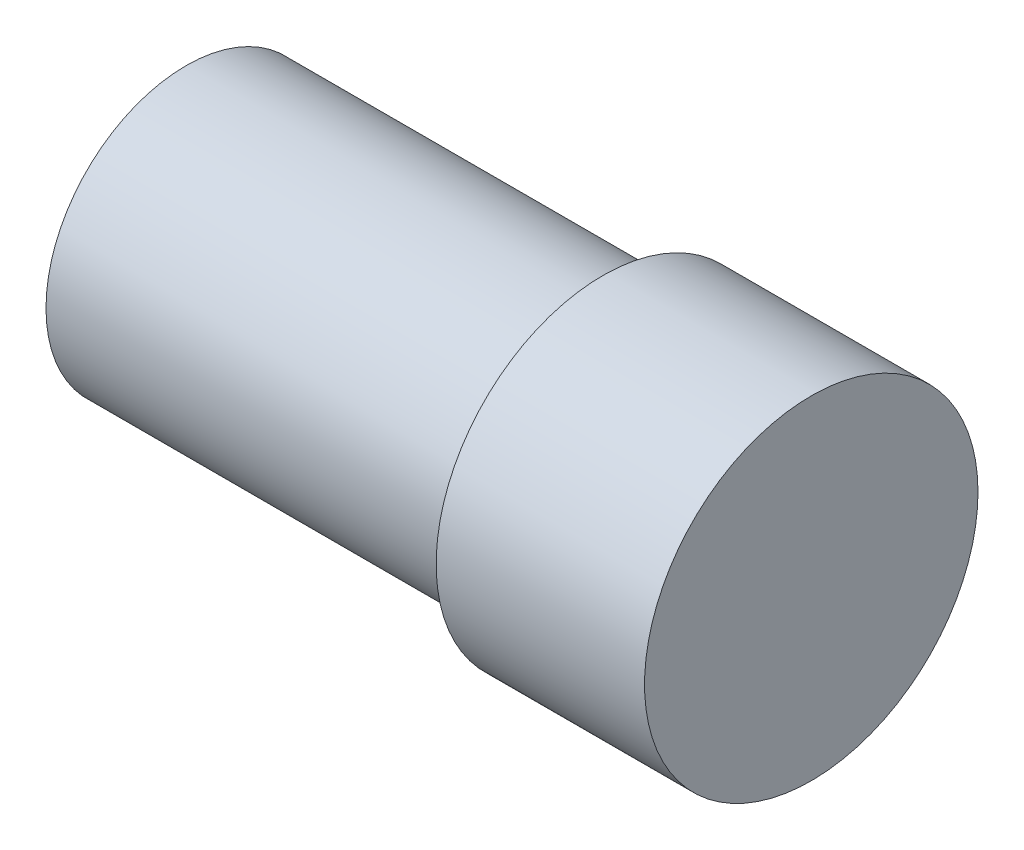
ISO-10303-21;
HEADER;
FILE_DESCRIPTION(('STEP AP214'),'2;1');
FILE_NAME('part.step','',(''),(''),'','','');
FILE_SCHEMA(('AUTOMOTIVE_DESIGN { 1 0 10303 214 1 1 1 1 }'));
ENDSEC;
DATA;
#1=APPLICATION_CONTEXT('core data for automotive mechanical design processes');
#2=APPLICATION_PROTOCOL_DEFINITION('international standard','automotive_design',2000,#1);
#3=PRODUCT_CONTEXT('',#1,'mechanical');
#4=PRODUCT('Part','Part','',(#3));
#5=PRODUCT_RELATED_PRODUCT_CATEGORY('part','',(#4));
#6=PRODUCT_DEFINITION_FORMATION('','',#4);
#7=PRODUCT_DEFINITION_CONTEXT('part definition',#1,'design');
#8=PRODUCT_DEFINITION('design','',#6,#7);
#9=PRODUCT_DEFINITION_SHAPE('','',#8);
#10=(LENGTH_UNIT() NAMED_UNIT(*) SI_UNIT(.MILLI.,.METRE.));
#11=(NAMED_UNIT(*) PLANE_ANGLE_UNIT() SI_UNIT($,.RADIAN.));
#12=(NAMED_UNIT(*) SI_UNIT($,.STERADIAN.) SOLID_ANGLE_UNIT());
#13=UNCERTAINTY_MEASURE_WITH_UNIT(LENGTH_MEASURE(1.E-05),#10,'distance_accuracy_value','');
#14=(GEOMETRIC_REPRESENTATION_CONTEXT(3) GLOBAL_UNCERTAINTY_ASSIGNED_CONTEXT((#13)) GLOBAL_UNIT_ASSIGNED_CONTEXT((#10,
#11,#12)) REPRESENTATION_CONTEXT('',''));
#15=CARTESIAN_POINT('',(0.,0.,0.));
#16=DIRECTION('',(0.,0.,1.));
#17=DIRECTION('',(1.,0.,0.));
#18=AXIS2_PLACEMENT_3D('',#15,#16,#17);
#19=CARTESIAN_POINT('',(0.,0.,0.));
#20=DIRECTION('',(1.,0.,0.));
#21=DIRECTION('',(0.,0.,-1.));
#22=AXIS2_PLACEMENT_3D('',#19,#20,#21);
#23=PLANE('',#22);
#24=CARTESIAN_POINT('',(0.,0.,0.));
#25=DIRECTION('',(1.,0.,0.));
#26=DIRECTION('',(0.,0.,-1.));
#27=AXIS2_PLACEMENT_3D('',#24,#25,#26);
#28=CIRCLE('',#27,5.08);
#29=CARTESIAN_POINT('',(0.,0.,-5.08));
#30=VERTEX_POINT('',#29);
#31=EDGE_CURVE('E42',#30,#30,#28,.T.);
#32=ORIENTED_EDGE('',*,*,#31,.F.);
#33=EDGE_LOOP('',(#32));
#34=FACE_BOUND('',#33,.T.);
#35=CARTESIAN_POINT('',(0.,0.,0.));
#36=DIRECTION('',(1.,0.,0.));
#37=DIRECTION('',(0.,0.,-1.));
#38=AXIS2_PLACEMENT_3D('',#35,#36,#37);
#39=CIRCLE('',#38,4.2672);
#40=CARTESIAN_POINT('',(0.,0.,-4.2672));
#41=VERTEX_POINT('',#40);
#42=EDGE_CURVE('E10',#41,#41,#39,.F.);
#43=ORIENTED_EDGE('',*,*,#42,.F.);
#44=EDGE_LOOP('',(#43));
#45=FACE_BOUND('',#44,.T.);
#46=ADVANCED_FACE('F31',(#34,#45),#23,.F.);
#47=CARTESIAN_POINT('',(6.35,0.,0.));
#48=DIRECTION('',(-1.,0.,0.));
#49=DIRECTION('',(0.,0.,1.));
#50=AXIS2_PLACEMENT_3D('',#47,#48,#49);
#51=CYLINDRICAL_SURFACE('',#50,5.08);
#52=CARTESIAN_POINT('',(6.35,0.,0.));
#53=DIRECTION('',(1.,0.,0.));
#54=DIRECTION('',(0.,0.,-1.));
#55=AXIS2_PLACEMENT_3D('',#52,#53,#54);
#56=CIRCLE('',#55,5.08);
#57=CARTESIAN_POINT('',(6.35,0.,-5.08));
#58=VERTEX_POINT('',#57);
#59=EDGE_CURVE('E38',#58,#58,#56,.T.);
#60=ORIENTED_EDGE('',*,*,#59,.F.);
#61=EDGE_LOOP('',(#60));
#62=FACE_BOUND('',#61,.T.);
#63=ORIENTED_EDGE('',*,*,#31,.T.);
#64=EDGE_LOOP('',(#63));
#65=FACE_BOUND('',#64,.T.);
#66=ADVANCED_FACE('F33',(#62,#65),#51,.T.);
#67=CARTESIAN_POINT('',(6.35,0.,0.));
#68=DIRECTION('',(1.,0.,0.));
#69=DIRECTION('',(0.,0.,-1.));
#70=AXIS2_PLACEMENT_3D('',#67,#68,#69);
#71=PLANE('',#70);
#72=ORIENTED_EDGE('',*,*,#59,.T.);
#73=EDGE_LOOP('',(#72));
#74=FACE_BOUND('',#73,.T.);
#75=ADVANCED_FACE('F69',(#74),#71,.T.);
#76=CARTESIAN_POINT('',(-12.7,0.,0.));
#77=DIRECTION('',(1.,0.,0.));
#78=DIRECTION('',(0.,0.,-1.));
#79=AXIS2_PLACEMENT_3D('',#76,#77,#78);
#80=CYLINDRICAL_SURFACE('',#79,4.2672);
#81=CARTESIAN_POINT('',(-12.7,0.,0.));
#82=DIRECTION('',(-1.,0.,0.));
#83=DIRECTION('',(0.,0.,1.));
#84=AXIS2_PLACEMENT_3D('',#81,#82,#83);
#85=CIRCLE('',#84,4.2672);
#86=CARTESIAN_POINT('',(-12.7,0.,4.2672));
#87=VERTEX_POINT('',#86);
#88=EDGE_CURVE('E47',#87,#87,#85,.T.);
#89=ORIENTED_EDGE('',*,*,#88,.F.);
#90=EDGE_LOOP('',(#89));
#91=FACE_BOUND('',#90,.T.);
#92=ORIENTED_EDGE('',*,*,#42,.T.);
#93=EDGE_LOOP('',(#92));
#94=FACE_BOUND('',#93,.T.);
#95=ADVANCED_FACE('F64',(#91,#94),#80,.T.);
#96=CARTESIAN_POINT('',(-12.7,0.,0.));
#97=DIRECTION('',(-1.,0.,0.));
#98=DIRECTION('',(0.,0.,1.));
#99=AXIS2_PLACEMENT_3D('',#96,#97,#98);
#100=PLANE('',#99);
#101=CARTESIAN_POINT('',(-12.7,0.,0.));
#102=DIRECTION('',(-1.,0.,0.));
#103=DIRECTION('',(0.,0.,1.));
#104=AXIS2_PLACEMENT_3D('',#101,#102,#103);
#105=CIRCLE('',#104,1.999999937);
#106=CARTESIAN_POINT('',(-12.7,0.,1.999999937));
#107=VERTEX_POINT('',#106);
#108=EDGE_CURVE('E54',#107,#107,#105,.T.);
#109=ORIENTED_EDGE('',*,*,#108,.F.);
#110=EDGE_LOOP('',(#109));
#111=FACE_BOUND('',#110,.T.);
#112=ORIENTED_EDGE('',*,*,#88,.T.);
#113=EDGE_LOOP('',(#112));
#114=FACE_BOUND('',#113,.T.);
#115=ADVANCED_FACE('F60',(#111,#114),#100,.T.);
#116=CARTESIAN_POINT('',(0.,0.,0.));
#117=DIRECTION('',(1.,0.,0.));
#118=DIRECTION('',(0.,0.,-1.));
#119=AXIS2_PLACEMENT_3D('',#116,#117,#118);
#120=PLANE('',#119);
#121=CARTESIAN_POINT('',(0.,0.,0.));
#122=DIRECTION('',(-1.,0.,0.));
#123=DIRECTION('',(0.,0.,1.));
#124=AXIS2_PLACEMENT_3D('',#121,#122,#123);
#125=CIRCLE('',#124,1.999999937);
#126=CARTESIAN_POINT('',(0.,0.,1.999999937));
#127=VERTEX_POINT('',#126);
#128=EDGE_CURVE('E51',#127,#127,#125,.T.);
#129=ORIENTED_EDGE('',*,*,#128,.T.);
#130=EDGE_LOOP('',(#129));
#131=FACE_BOUND('',#130,.T.);
#132=ADVANCED_FACE('F63',(#131),#120,.F.);
#133=CARTESIAN_POINT('',(-12.7,0.,0.));
#134=DIRECTION('',(-1.,0.,0.));
#135=DIRECTION('',(0.,0.,1.));
#136=AXIS2_PLACEMENT_3D('',#133,#134,#135);
#137=CYLINDRICAL_SURFACE('',#136,1.999999937);
#138=ORIENTED_EDGE('',*,*,#128,.F.);
#139=EDGE_LOOP('',(#138));
#140=FACE_BOUND('',#139,.T.);
#141=ORIENTED_EDGE('',*,*,#108,.T.);
#142=EDGE_LOOP('',(#141));
#143=FACE_BOUND('',#142,.T.);
#144=ADVANCED_FACE('F58',(#140,#143),#137,.F.);
#145=CLOSED_SHELL('',(#46,#66,#75,#95,#115,#132,#144));
#146=MANIFOLD_SOLID_BREP('B2',#145);
#147=ADVANCED_BREP_SHAPE_REPRESENTATION('',(#18,#146),#14);
#148=SHAPE_DEFINITION_REPRESENTATION(#9,#147);
ENDSEC;
END-ISO-10303-21;
